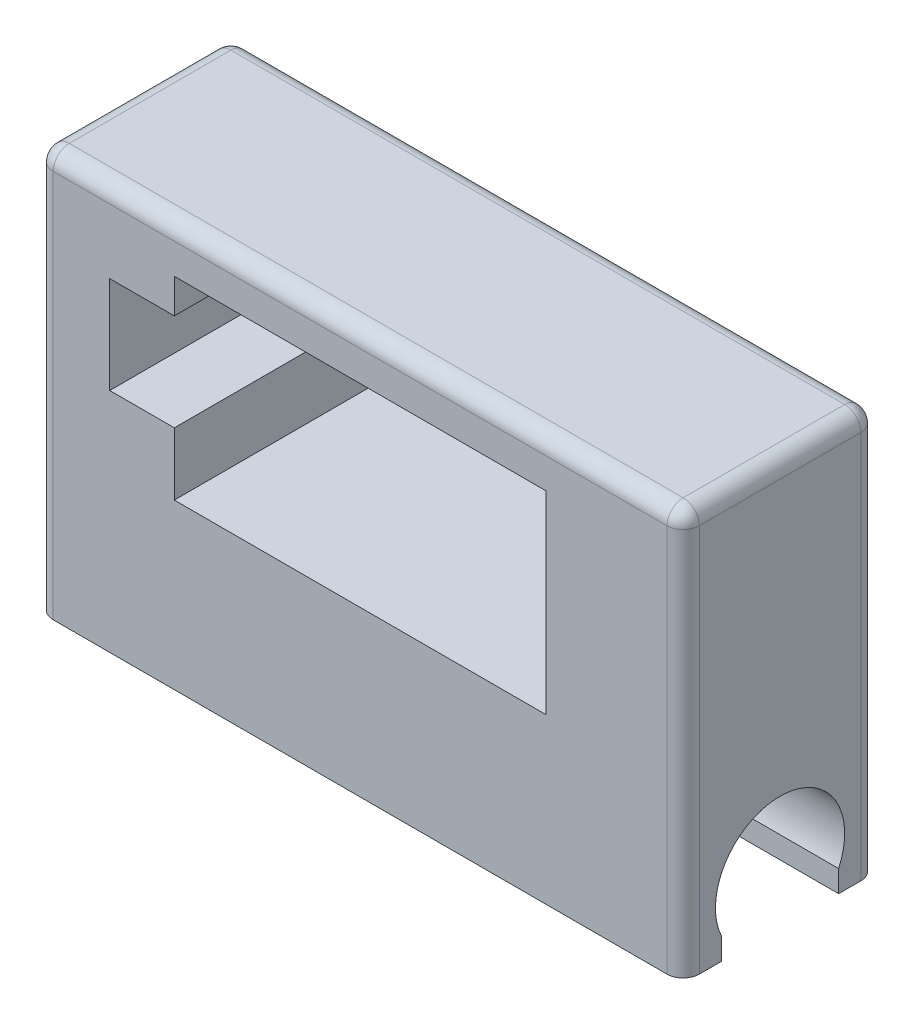
ISO-10303-21;
HEADER;
FILE_DESCRIPTION(('STEP AP214'),'2;1');
FILE_NAME('part.step','',(''),(''),'','','');
FILE_SCHEMA(('AUTOMOTIVE_DESIGN { 1 0 10303 214 1 1 1 1 }'));
ENDSEC;
DATA;
#1=APPLICATION_CONTEXT('core data for automotive mechanical design processes');
#2=APPLICATION_PROTOCOL_DEFINITION('international standard','automotive_design',2000,#1);
#3=PRODUCT_CONTEXT('',#1,'mechanical');
#4=PRODUCT('Part','Part','',(#3));
#5=PRODUCT_RELATED_PRODUCT_CATEGORY('part','',(#4));
#6=PRODUCT_DEFINITION_FORMATION('','',#4);
#7=PRODUCT_DEFINITION_CONTEXT('part definition',#1,'design');
#8=PRODUCT_DEFINITION('design','',#6,#7);
#9=PRODUCT_DEFINITION_SHAPE('','',#8);
#10=(LENGTH_UNIT() NAMED_UNIT(*) SI_UNIT(.MILLI.,.METRE.));
#11=(NAMED_UNIT(*) PLANE_ANGLE_UNIT() SI_UNIT($,.RADIAN.));
#12=(NAMED_UNIT(*) SI_UNIT($,.STERADIAN.) SOLID_ANGLE_UNIT());
#13=UNCERTAINTY_MEASURE_WITH_UNIT(LENGTH_MEASURE(1.E-05),#10,'distance_accuracy_value','');
#14=(GEOMETRIC_REPRESENTATION_CONTEXT(3) GLOBAL_UNCERTAINTY_ASSIGNED_CONTEXT((#13)) GLOBAL_UNIT_ASSIGNED_CONTEXT((#10,
#11,#12)) REPRESENTATION_CONTEXT('',''));
#15=CARTESIAN_POINT('',(0.,0.,0.));
#16=DIRECTION('',(0.,0.,1.));
#17=DIRECTION('',(1.,0.,0.));
#18=AXIS2_PLACEMENT_3D('',#15,#16,#17);
#19=CARTESIAN_POINT('',(40.,-3.04188906600156,3.625));
#20=DIRECTION('',(0.,1.,0.));
#21=DIRECTION('',(0.,0.,1.));
#22=AXIS2_PLACEMENT_3D('',#19,#20,#21);
#23=PLANE('',#22);
#24=DIRECTION('',(0.,0.,-1.));
#25=VECTOR('',#24,1.);
#26=CARTESIAN_POINT('',(40.,-3.04188906600156,3.625));
#27=LINE('',#26,#25);
#28=CARTESIAN_POINT('',(40.,-3.04188906600156,5.));
#29=VERTEX_POINT('',#28);
#30=CARTESIAN_POINT('',(40.,-3.04188906600156,3.625));
#31=VERTEX_POINT('',#30);
#32=EDGE_CURVE('E270',#29,#31,#27,.T.);
#33=ORIENTED_EDGE('',*,*,#32,.F.);
#34=CARTESIAN_POINT('',(39.,-3.04188906600156,5.));
#35=DIRECTION('',(0.,1.,0.));
#36=DIRECTION('',(0.,0.,1.));
#37=AXIS2_PLACEMENT_3D('',#34,#35,#36);
#38=CIRCLE('',#37,1.);
#39=CARTESIAN_POINT('',(39.,-3.04188906600156,6.));
#40=VERTEX_POINT('',#39);
#41=EDGE_CURVE('E376',#29,#40,#38,.F.);
#42=ORIENTED_EDGE('',*,*,#41,.T.);
#43=DIRECTION('',(-1.,0.,0.));
#44=VECTOR('',#43,1.);
#45=CARTESIAN_POINT('',(40.,-3.04188906600156,6.));
#46=LINE('',#45,#44);
#47=CARTESIAN_POINT('',(1.,-3.04188906600156,6.));
#48=VERTEX_POINT('',#47);
#49=EDGE_CURVE('E287',#40,#48,#46,.T.);
#50=ORIENTED_EDGE('',*,*,#49,.T.);
#51=CARTESIAN_POINT('',(1.,-3.04188906600156,5.));
#52=DIRECTION('',(0.,1.,0.));
#53=DIRECTION('',(0.,0.,1.));
#54=AXIS2_PLACEMENT_3D('',#51,#52,#53);
#55=CIRCLE('',#54,1.);
#56=CARTESIAN_POINT('',(0.,-3.04188906600156,5.));
#57=VERTEX_POINT('',#56);
#58=EDGE_CURVE('E373',#48,#57,#55,.F.);
#59=ORIENTED_EDGE('',*,*,#58,.T.);
#60=DIRECTION('',(0.,0.,-1.));
#61=VECTOR('',#60,1.);
#62=CARTESIAN_POINT('',(0.,-3.04188906600156,3.625));
#63=LINE('',#62,#61);
#64=CARTESIAN_POINT('',(0.,-3.04188906600156,3.625));
#65=VERTEX_POINT('',#64);
#66=EDGE_CURVE('E288',#57,#65,#63,.T.);
#67=ORIENTED_EDGE('',*,*,#66,.T.);
#68=DIRECTION('',(-1.,0.,0.));
#69=VECTOR('',#68,1.);
#70=CARTESIAN_POINT('',(40.,-3.04188906600156,3.625));
#71=LINE('',#70,#69);
#72=EDGE_CURVE('E321',#31,#65,#71,.T.);
#73=ORIENTED_EDGE('',*,*,#72,.F.);
#74=EDGE_LOOP('',(#33,#42,#50,#59,#67,#73));
#75=FACE_BOUND('',#74,.T.);
#76=ADVANCED_FACE('F45',(#75),#23,.F.);
#77=CARTESIAN_POINT('',(40.,-1.69096865730859,3.625));
#78=DIRECTION('',(0.,0.,1.));
#79=DIRECTION('',(1.,0.,0.));
#80=AXIS2_PLACEMENT_3D('',#77,#78,#79);
#81=PLANE('',#80);
#82=DIRECTION('',(0.,1.,0.));
#83=VECTOR('',#82,1.);
#84=CARTESIAN_POINT('',(0.,-1.69096865730859,3.625));
#85=LINE('',#84,#83);
#86=CARTESIAN_POINT('',(0.,-1.69096865730859,3.625));
#87=VERTEX_POINT('',#86);
#88=EDGE_CURVE('E291',#65,#87,#85,.T.);
#89=ORIENTED_EDGE('',*,*,#88,.T.);
#90=DIRECTION('',(-1.,0.,0.));
#91=VECTOR('',#90,1.);
#92=CARTESIAN_POINT('',(40.,-1.69096865730859,3.625));
#93=LINE('',#92,#91);
#94=CARTESIAN_POINT('',(40.,-1.69096865730859,3.625));
#95=VERTEX_POINT('',#94);
#96=EDGE_CURVE('E317',#95,#87,#93,.T.);
#97=ORIENTED_EDGE('',*,*,#96,.F.);
#98=DIRECTION('',(0.,1.,0.));
#99=VECTOR('',#98,1.);
#100=CARTESIAN_POINT('',(40.,-1.69096865730859,3.625));
#101=LINE('',#100,#99);
#102=EDGE_CURVE('E273',#31,#95,#101,.T.);
#103=ORIENTED_EDGE('',*,*,#102,.F.);
#104=ORIENTED_EDGE('',*,*,#72,.T.);
#105=EDGE_LOOP('',(#89,#97,#103,#104));
#106=FACE_BOUND('',#105,.T.);
#107=ADVANCED_FACE('F476',(#106),#81,.F.);
#108=CARTESIAN_POINT('',(40.,0.,0.));
#109=DIRECTION('',(-1.,0.,0.));
#110=DIRECTION('',(0.,0.,1.));
#111=AXIS2_PLACEMENT_3D('',#108,#109,#110);
#112=CYLINDRICAL_SURFACE('',#111,4.);
#113=CARTESIAN_POINT('',(0.,0.,0.));
#114=DIRECTION('',(-1.,0.,0.));
#115=DIRECTION('',(0.,0.,-1.));
#116=AXIS2_PLACEMENT_3D('',#113,#114,#115);
#117=CIRCLE('',#116,4.);
#118=CARTESIAN_POINT('',(0.,-1.69096865730859,-3.625));
#119=VERTEX_POINT('',#118);
#120=EDGE_CURVE('E294',#87,#119,#117,.T.);
#121=ORIENTED_EDGE('',*,*,#120,.T.);
#122=DIRECTION('',(-1.,0.,0.));
#123=VECTOR('',#122,1.);
#124=CARTESIAN_POINT('',(40.,-1.69096865730859,-3.625));
#125=LINE('',#124,#123);
#126=CARTESIAN_POINT('',(40.,-1.69096865730859,-3.625));
#127=VERTEX_POINT('',#126);
#128=EDGE_CURVE('E313',#127,#119,#125,.T.);
#129=ORIENTED_EDGE('',*,*,#128,.F.);
#130=CARTESIAN_POINT('',(40.,0.,0.));
#131=DIRECTION('',(-1.,0.,0.));
#132=DIRECTION('',(0.,0.,-1.));
#133=AXIS2_PLACEMENT_3D('',#130,#131,#132);
#134=CIRCLE('',#133,4.);
#135=EDGE_CURVE('E277',#95,#127,#134,.T.);
#136=ORIENTED_EDGE('',*,*,#135,.F.);
#137=ORIENTED_EDGE('',*,*,#96,.T.);
#138=EDGE_LOOP('',(#121,#129,#136,#137));
#139=FACE_BOUND('',#138,.T.);
#140=ADVANCED_FACE('F483',(#139),#112,.F.);
#141=CARTESIAN_POINT('',(40.,-1.69096865730859,-3.625));
#142=DIRECTION('',(0.,0.,-1.));
#143=DIRECTION('',(-1.,0.,0.));
#144=AXIS2_PLACEMENT_3D('',#141,#142,#143);
#145=PLANE('',#144);
#146=DIRECTION('',(0.,-1.,0.));
#147=VECTOR('',#146,1.);
#148=CARTESIAN_POINT('',(0.,-1.69096865730859,-3.625));
#149=LINE('',#148,#147);
#150=CARTESIAN_POINT('',(0.,-3.04188906600156,-3.625));
#151=VERTEX_POINT('',#150);
#152=EDGE_CURVE('E297',#119,#151,#149,.T.);
#153=ORIENTED_EDGE('',*,*,#152,.T.);
#154=DIRECTION('',(-1.,0.,0.));
#155=VECTOR('',#154,1.);
#156=CARTESIAN_POINT('',(40.,-3.04188906600156,-3.625));
#157=LINE('',#156,#155);
#158=CARTESIAN_POINT('',(40.,-3.04188906600156,-3.625));
#159=VERTEX_POINT('',#158);
#160=EDGE_CURVE('E309',#159,#151,#157,.T.);
#161=ORIENTED_EDGE('',*,*,#160,.F.);
#162=DIRECTION('',(0.,-1.,0.));
#163=VECTOR('',#162,1.);
#164=CARTESIAN_POINT('',(40.,-1.69096865730859,-3.625));
#165=LINE('',#164,#163);
#166=EDGE_CURVE('E280',#127,#159,#165,.T.);
#167=ORIENTED_EDGE('',*,*,#166,.F.);
#168=ORIENTED_EDGE('',*,*,#128,.T.);
#169=EDGE_LOOP('',(#153,#161,#167,#168));
#170=FACE_BOUND('',#169,.T.);
#171=ADVANCED_FACE('F578',(#170),#145,.F.);
#172=CARTESIAN_POINT('',(40.,-3.04188906600156,-3.625));
#173=DIRECTION('',(0.,1.,0.));
#174=DIRECTION('',(0.,0.,1.));
#175=AXIS2_PLACEMENT_3D('',#172,#173,#174);
#176=PLANE('',#175);
#177=DIRECTION('',(-1.,0.,0.));
#178=VECTOR('',#177,1.);
#179=CARTESIAN_POINT('',(40.,-3.04188906600156,-6.));
#180=LINE('',#179,#178);
#181=CARTESIAN_POINT('',(39.,-3.04188906600156,-6.));
#182=VERTEX_POINT('',#181);
#183=CARTESIAN_POINT('',(1.,-3.04188906600156,-6.));
#184=VERTEX_POINT('',#183);
#185=EDGE_CURVE('E306',#182,#184,#180,.T.);
#186=ORIENTED_EDGE('',*,*,#185,.F.);
#187=CARTESIAN_POINT('',(39.,-3.04188906600156,-5.));
#188=DIRECTION('',(0.,1.,0.));
#189=DIRECTION('',(0.,0.,1.));
#190=AXIS2_PLACEMENT_3D('',#187,#188,#189);
#191=CIRCLE('',#190,1.);
#192=CARTESIAN_POINT('',(40.,-3.04188906600156,-5.));
#193=VERTEX_POINT('',#192);
#194=EDGE_CURVE('E11',#182,#193,#191,.F.);
#195=ORIENTED_EDGE('',*,*,#194,.T.);
#196=DIRECTION('',(0.,0.,-1.));
#197=VECTOR('',#196,1.);
#198=CARTESIAN_POINT('',(40.,-3.04188906600156,-3.625));
#199=LINE('',#198,#197);
#200=EDGE_CURVE('E283',#159,#193,#199,.T.);
#201=ORIENTED_EDGE('',*,*,#200,.F.);
#202=ORIENTED_EDGE('',*,*,#160,.T.);
#203=DIRECTION('',(0.,0.,-1.));
#204=VECTOR('',#203,1.);
#205=CARTESIAN_POINT('',(0.,-3.04188906600156,-3.625));
#206=LINE('',#205,#204);
#207=CARTESIAN_POINT('',(0.,-3.04188906600156,-5.));
#208=VERTEX_POINT('',#207);
#209=EDGE_CURVE('E274',#151,#208,#206,.T.);
#210=ORIENTED_EDGE('',*,*,#209,.T.);
#211=CARTESIAN_POINT('',(1.,-3.04188906600156,-5.));
#212=DIRECTION('',(0.,1.,0.));
#213=DIRECTION('',(0.,0.,1.));
#214=AXIS2_PLACEMENT_3D('',#211,#212,#213);
#215=CIRCLE('',#214,1.);
#216=EDGE_CURVE('E55',#208,#184,#215,.F.);
#217=ORIENTED_EDGE('',*,*,#216,.T.);
#218=EDGE_LOOP('',(#186,#195,#201,#202,#210,#217));
#219=FACE_BOUND('',#218,.T.);
#220=ADVANCED_FACE('F564',(#219),#176,.F.);
#221=CARTESIAN_POINT('',(40.,-3.04188906600156,-6.));
#222=DIRECTION('',(0.,0.,1.));
#223=DIRECTION('',(0.,-1.,0.));
#224=AXIS2_PLACEMENT_3D('',#221,#222,#223);
#225=PLANE('',#224);
#226=DIRECTION('',(1.,0.,0.));
#227=VECTOR('',#226,1.);
#228=CARTESIAN_POINT('',(40.,21.,-6.));
#229=LINE('',#228,#227);
#230=CARTESIAN_POINT('',(1.,21.,-6.));
#231=VERTEX_POINT('',#230);
#232=CARTESIAN_POINT('',(39.,21.,-6.));
#233=VERTEX_POINT('',#232);
#234=EDGE_CURVE('E63',#231,#233,#229,.T.);
#235=ORIENTED_EDGE('',*,*,#234,.T.);
#236=DIRECTION('',(0.,1.,0.));
#237=VECTOR('',#236,1.);
#238=CARTESIAN_POINT('',(39.,-3.04188906600156,-6.));
#239=LINE('',#238,#237);
#240=EDGE_CURVE('E370',#233,#182,#239,.F.);
#241=ORIENTED_EDGE('',*,*,#240,.T.);
#242=ORIENTED_EDGE('',*,*,#185,.T.);
#243=DIRECTION('',(0.,1.,0.));
#244=VECTOR('',#243,1.);
#245=CARTESIAN_POINT('',(1.,-3.04188906600156,-6.));
#246=LINE('',#245,#244);
#247=EDGE_CURVE('E68',#184,#231,#246,.T.);
#248=ORIENTED_EDGE('',*,*,#247,.T.);
#249=EDGE_LOOP('',(#235,#241,#242,#248));
#250=FACE_BOUND('',#249,.T.);
#251=DIRECTION('',(-1.,0.,0.));
#252=VECTOR('',#251,1.);
#253=CARTESIAN_POINT('',(8.5,7.125,-6.));
#254=LINE('',#253,#252);
#255=CARTESIAN_POINT('',(31.5,7.125,-6.));
#256=VERTEX_POINT('',#255);
#257=CARTESIAN_POINT('',(8.5,7.125,-6.));
#258=VERTEX_POINT('',#257);
#259=EDGE_CURVE('E250',#256,#258,#254,.T.);
#260=ORIENTED_EDGE('',*,*,#259,.F.);
#261=DIRECTION('',(0.,-1.,0.));
#262=VECTOR('',#261,1.);
#263=CARTESIAN_POINT('',(31.5,7.12500000000001,-6.));
#264=LINE('',#263,#262);
#265=CARTESIAN_POINT('',(31.5,19.125,-6.));
#266=VERTEX_POINT('',#265);
#267=EDGE_CURVE('E204',#266,#256,#264,.T.);
#268=ORIENTED_EDGE('',*,*,#267,.F.);
#269=DIRECTION('',(1.,0.,0.));
#270=VECTOR('',#269,1.);
#271=CARTESIAN_POINT('',(8.5,19.125,-6.));
#272=LINE('',#271,#270);
#273=CARTESIAN_POINT('',(8.5,19.125,-6.));
#274=VERTEX_POINT('',#273);
#275=EDGE_CURVE('E448',#274,#266,#272,.T.);
#276=ORIENTED_EDGE('',*,*,#275,.F.);
#277=DIRECTION('',(0.,1.,0.));
#278=VECTOR('',#277,1.);
#279=CARTESIAN_POINT('',(8.5,17.,-6.));
#280=LINE('',#279,#278);
#281=CARTESIAN_POINT('',(8.5,17.,-6.));
#282=VERTEX_POINT('',#281);
#283=EDGE_CURVE('E444',#282,#274,#280,.T.);
#284=ORIENTED_EDGE('',*,*,#283,.F.);
#285=DIRECTION('',(1.,0.,0.));
#286=VECTOR('',#285,1.);
#287=CARTESIAN_POINT('',(8.5,17.,-6.));
#288=LINE('',#287,#286);
#289=CARTESIAN_POINT('',(4.5,17.,-6.));
#290=VERTEX_POINT('',#289);
#291=EDGE_CURVE('E440',#290,#282,#288,.T.);
#292=ORIENTED_EDGE('',*,*,#291,.F.);
#293=DIRECTION('',(0.,1.,0.));
#294=VECTOR('',#293,1.);
#295=CARTESIAN_POINT('',(4.5,11.,-6.));
#296=LINE('',#295,#294);
#297=CARTESIAN_POINT('',(4.5,11.,-6.));
#298=VERTEX_POINT('',#297);
#299=EDGE_CURVE('E436',#298,#290,#296,.T.);
#300=ORIENTED_EDGE('',*,*,#299,.F.);
#301=DIRECTION('',(-1.,0.,0.));
#302=VECTOR('',#301,1.);
#303=CARTESIAN_POINT('',(8.5,11.,-6.));
#304=LINE('',#303,#302);
#305=CARTESIAN_POINT('',(8.5,11.,-6.));
#306=VERTEX_POINT('',#305);
#307=EDGE_CURVE('E432',#306,#298,#304,.T.);
#308=ORIENTED_EDGE('',*,*,#307,.F.);
#309=DIRECTION('',(0.,1.,0.));
#310=VECTOR('',#309,1.);
#311=CARTESIAN_POINT('',(8.5,7.12500000000001,-6.));
#312=LINE('',#311,#310);
#313=EDGE_CURVE('E269',#258,#306,#312,.T.);
#314=ORIENTED_EDGE('',*,*,#313,.F.);
#315=EDGE_LOOP('',(#260,#268,#276,#284,#292,#300,#308,#314));
#316=FACE_BOUND('',#315,.T.);
#317=ADVANCED_FACE('F457',(#250,#316),#225,.F.);
#318=CARTESIAN_POINT('',(40.,-3.04188906600156,6.));
#319=DIRECTION('',(0.,0.,-1.));
#320=DIRECTION('',(0.,1.,0.));
#321=AXIS2_PLACEMENT_3D('',#318,#319,#320);
#322=PLANE('',#321);
#323=ORIENTED_EDGE('',*,*,#49,.F.);
#324=DIRECTION('',(0.,-1.,0.));
#325=VECTOR('',#324,1.);
#326=CARTESIAN_POINT('',(39.,22.,6.));
#327=LINE('',#326,#325);
#328=CARTESIAN_POINT('',(39.,21.,6.));
#329=VERTEX_POINT('',#328);
#330=EDGE_CURVE('E354',#40,#329,#327,.F.);
#331=ORIENTED_EDGE('',*,*,#330,.T.);
#332=DIRECTION('',(-1.,0.,0.));
#333=VECTOR('',#332,1.);
#334=CARTESIAN_POINT('',(0.,21.,6.));
#335=LINE('',#334,#333);
#336=CARTESIAN_POINT('',(1.,21.,6.));
#337=VERTEX_POINT('',#336);
#338=EDGE_CURVE('E351',#329,#337,#335,.T.);
#339=ORIENTED_EDGE('',*,*,#338,.T.);
#340=DIRECTION('',(0.,-1.,0.));
#341=VECTOR('',#340,1.);
#342=CARTESIAN_POINT('',(1.,-3.04188906600156,6.));
#343=LINE('',#342,#341);
#344=EDGE_CURVE('E348',#337,#48,#343,.T.);
#345=ORIENTED_EDGE('',*,*,#344,.T.);
#346=EDGE_LOOP('',(#323,#331,#339,#345));
#347=FACE_BOUND('',#346,.T.);
#348=DIRECTION('',(1.,0.,0.));
#349=VECTOR('',#348,1.);
#350=CARTESIAN_POINT('',(8.5,7.125,6.));
#351=LINE('',#350,#349);
#352=CARTESIAN_POINT('',(8.5,7.125,6.));
#353=VERTEX_POINT('',#352);
#354=CARTESIAN_POINT('',(31.5,7.125,6.));
#355=VERTEX_POINT('',#354);
#356=EDGE_CURVE('E212',#353,#355,#351,.T.);
#357=ORIENTED_EDGE('',*,*,#356,.F.);
#358=DIRECTION('',(0.,-1.,0.));
#359=VECTOR('',#358,1.);
#360=CARTESIAN_POINT('',(8.5,7.125,6.));
#361=LINE('',#360,#359);
#362=CARTESIAN_POINT('',(8.5,11.,6.));
#363=VERTEX_POINT('',#362);
#364=EDGE_CURVE('E219',#363,#353,#361,.T.);
#365=ORIENTED_EDGE('',*,*,#364,.F.);
#366=DIRECTION('',(1.,0.,0.));
#367=VECTOR('',#366,1.);
#368=CARTESIAN_POINT('',(8.5,11.,6.));
#369=LINE('',#368,#367);
#370=CARTESIAN_POINT('',(4.5,11.,6.));
#371=VERTEX_POINT('',#370);
#372=EDGE_CURVE('E243',#371,#363,#369,.T.);
#373=ORIENTED_EDGE('',*,*,#372,.F.);
#374=DIRECTION('',(0.,-1.,0.));
#375=VECTOR('',#374,1.);
#376=CARTESIAN_POINT('',(4.5,11.,6.));
#377=LINE('',#376,#375);
#378=CARTESIAN_POINT('',(4.5,17.,6.));
#379=VERTEX_POINT('',#378);
#380=EDGE_CURVE('E239',#379,#371,#377,.T.);
#381=ORIENTED_EDGE('',*,*,#380,.F.);
#382=DIRECTION('',(-1.,0.,0.));
#383=VECTOR('',#382,1.);
#384=CARTESIAN_POINT('',(8.5,17.,6.));
#385=LINE('',#384,#383);
#386=CARTESIAN_POINT('',(8.5,17.,6.));
#387=VERTEX_POINT('',#386);
#388=EDGE_CURVE('E235',#387,#379,#385,.T.);
#389=ORIENTED_EDGE('',*,*,#388,.F.);
#390=DIRECTION('',(0.,-1.,0.));
#391=VECTOR('',#390,1.);
#392=CARTESIAN_POINT('',(8.5,17.,6.));
#393=LINE('',#392,#391);
#394=CARTESIAN_POINT('',(8.5,19.125,6.));
#395=VERTEX_POINT('',#394);
#396=EDGE_CURVE('E228',#395,#387,#393,.T.);
#397=ORIENTED_EDGE('',*,*,#396,.F.);
#398=DIRECTION('',(-1.,0.,0.));
#399=VECTOR('',#398,1.);
#400=CARTESIAN_POINT('',(8.5,19.125,6.));
#401=LINE('',#400,#399);
#402=CARTESIAN_POINT('',(31.5,19.125,6.));
#403=VERTEX_POINT('',#402);
#404=EDGE_CURVE('E224',#403,#395,#401,.T.);
#405=ORIENTED_EDGE('',*,*,#404,.F.);
#406=DIRECTION('',(0.,1.,0.));
#407=VECTOR('',#406,1.);
#408=CARTESIAN_POINT('',(31.5,7.125,6.));
#409=LINE('',#408,#407);
#410=EDGE_CURVE('E202',#355,#403,#409,.T.);
#411=ORIENTED_EDGE('',*,*,#410,.F.);
#412=EDGE_LOOP('',(#357,#365,#373,#381,#389,#397,#405,#411));
#413=FACE_BOUND('',#412,.T.);
#414=ADVANCED_FACE('F221',(#347,#413),#322,.F.);
#415=CARTESIAN_POINT('',(40.,0.,0.));
#416=DIRECTION('',(1.,0.,0.));
#417=DIRECTION('',(0.,0.,-1.));
#418=AXIS2_PLACEMENT_3D('',#415,#416,#417);
#419=PLANE('',#418);
#420=DIRECTION('',(0.,0.,1.));
#421=VECTOR('',#420,1.);
#422=CARTESIAN_POINT('',(40.,21.,0.));
#423=LINE('',#422,#421);
#424=CARTESIAN_POINT('',(40.,21.,-5.));
#425=VERTEX_POINT('',#424);
#426=CARTESIAN_POINT('',(40.,21.,5.));
#427=VERTEX_POINT('',#426);
#428=EDGE_CURVE('E328',#425,#427,#423,.T.);
#429=ORIENTED_EDGE('',*,*,#428,.T.);
#430=DIRECTION('',(0.,-1.,0.));
#431=VECTOR('',#430,1.);
#432=CARTESIAN_POINT('',(40.,-3.04188906600156,5.));
#433=LINE('',#432,#431);
#434=EDGE_CURVE('E332',#427,#29,#433,.T.);
#435=ORIENTED_EDGE('',*,*,#434,.T.);
#436=ORIENTED_EDGE('',*,*,#32,.T.);
#437=ORIENTED_EDGE('',*,*,#102,.T.);
#438=ORIENTED_EDGE('',*,*,#135,.T.);
#439=ORIENTED_EDGE('',*,*,#166,.T.);
#440=ORIENTED_EDGE('',*,*,#200,.T.);
#441=DIRECTION('',(0.,1.,0.));
#442=VECTOR('',#441,1.);
#443=CARTESIAN_POINT('',(40.,22.,-5.));
#444=LINE('',#443,#442);
#445=EDGE_CURVE('E325',#193,#425,#444,.T.);
#446=ORIENTED_EDGE('',*,*,#445,.T.);
#447=EDGE_LOOP('',(#429,#435,#436,#437,#438,#439,#440,#446));
#448=FACE_BOUND('',#447,.T.);
#449=ADVANCED_FACE('F573',(#448),#419,.T.);
#450=CARTESIAN_POINT('',(0.,0.,0.));
#451=DIRECTION('',(1.,0.,0.));
#452=DIRECTION('',(0.,0.,-1.));
#453=AXIS2_PLACEMENT_3D('',#450,#451,#452);
#454=PLANE('',#453);
#455=ORIENTED_EDGE('',*,*,#66,.F.);
#456=DIRECTION('',(0.,-1.,0.));
#457=VECTOR('',#456,1.);
#458=CARTESIAN_POINT('',(0.,0.,5.));
#459=LINE('',#458,#457);
#460=CARTESIAN_POINT('',(0.,21.,5.));
#461=VERTEX_POINT('',#460);
#462=EDGE_CURVE('E363',#57,#461,#459,.F.);
#463=ORIENTED_EDGE('',*,*,#462,.T.);
#464=DIRECTION('',(0.,0.,1.));
#465=VECTOR('',#464,1.);
#466=CARTESIAN_POINT('',(0.,21.,-6.));
#467=LINE('',#466,#465);
#468=CARTESIAN_POINT('',(0.,21.,-5.));
#469=VERTEX_POINT('',#468);
#470=EDGE_CURVE('E360',#461,#469,#467,.F.);
#471=ORIENTED_EDGE('',*,*,#470,.T.);
#472=DIRECTION('',(0.,1.,0.));
#473=VECTOR('',#472,1.);
#474=CARTESIAN_POINT('',(0.,0.,-5.));
#475=LINE('',#474,#473);
#476=EDGE_CURVE('E357',#469,#208,#475,.F.);
#477=ORIENTED_EDGE('',*,*,#476,.T.);
#478=ORIENTED_EDGE('',*,*,#209,.F.);
#479=ORIENTED_EDGE('',*,*,#152,.F.);
#480=ORIENTED_EDGE('',*,*,#120,.F.);
#481=ORIENTED_EDGE('',*,*,#88,.F.);
#482=EDGE_LOOP('',(#455,#463,#471,#477,#478,#479,#480,#481));
#483=FACE_BOUND('',#482,.T.);
#484=ADVANCED_FACE('F540',(#483),#454,.F.);
#485=CARTESIAN_POINT('',(0.,22.,-49.081318457076));
#486=DIRECTION('',(0.,1.,0.));
#487=DIRECTION('',(0.,0.,1.));
#488=AXIS2_PLACEMENT_3D('',#485,#486,#487);
#489=PLANE('',#488);
#490=DIRECTION('',(-1.,0.,0.));
#491=VECTOR('',#490,1.);
#492=CARTESIAN_POINT('',(40.,22.,5.));
#493=LINE('',#492,#491);
#494=CARTESIAN_POINT('',(1.,22.,5.));
#495=VERTEX_POINT('',#494);
#496=CARTESIAN_POINT('',(39.,22.,5.));
#497=VERTEX_POINT('',#496);
#498=EDGE_CURVE('E341',#495,#497,#493,.F.);
#499=ORIENTED_EDGE('',*,*,#498,.T.);
#500=DIRECTION('',(0.,0.,1.));
#501=VECTOR('',#500,1.);
#502=CARTESIAN_POINT('',(39.,22.,-49.081318457076));
#503=LINE('',#502,#501);
#504=CARTESIAN_POINT('',(39.,22.,-5.));
#505=VERTEX_POINT('',#504);
#506=EDGE_CURVE('E344',#497,#505,#503,.F.);
#507=ORIENTED_EDGE('',*,*,#506,.T.);
#508=DIRECTION('',(1.,0.,0.));
#509=VECTOR('',#508,1.);
#510=CARTESIAN_POINT('',(0.,22.,-5.));
#511=LINE('',#510,#509);
#512=CARTESIAN_POINT('',(1.,22.,-5.));
#513=VERTEX_POINT('',#512);
#514=EDGE_CURVE('E335',#505,#513,#511,.F.);
#515=ORIENTED_EDGE('',*,*,#514,.T.);
#516=DIRECTION('',(0.,0.,1.));
#517=VECTOR('',#516,1.);
#518=CARTESIAN_POINT('',(1.,22.,6.));
#519=LINE('',#518,#517);
#520=EDGE_CURVE('E338',#513,#495,#519,.T.);
#521=ORIENTED_EDGE('',*,*,#520,.T.);
#522=EDGE_LOOP('',(#499,#507,#515,#521));
#523=FACE_BOUND('',#522,.T.);
#524=ADVANCED_FACE('F595',(#523),#489,.T.);
#525=CARTESIAN_POINT('',(8.5,7.125,-49.081318457076));
#526=DIRECTION('',(0.,-1.,0.));
#527=DIRECTION('',(1.,0.,0.));
#528=AXIS2_PLACEMENT_3D('',#525,#526,#527);
#529=PLANE('',#528);
#530=DIRECTION('',(0.,0.,1.));
#531=VECTOR('',#530,1.);
#532=CARTESIAN_POINT('',(31.5,7.125,-49.081318457076));
#533=LINE('',#532,#531);
#534=EDGE_CURVE('E197',#256,#355,#533,.T.);
#535=ORIENTED_EDGE('',*,*,#534,.F.);
#536=ORIENTED_EDGE('',*,*,#259,.T.);
#537=DIRECTION('',(0.,0.,1.));
#538=VECTOR('',#537,1.);
#539=CARTESIAN_POINT('',(8.5,7.125,-49.081318457076));
#540=LINE('',#539,#538);
#541=EDGE_CURVE('E209',#258,#353,#540,.T.);
#542=ORIENTED_EDGE('',*,*,#541,.T.);
#543=ORIENTED_EDGE('',*,*,#356,.T.);
#544=EDGE_LOOP('',(#535,#536,#542,#543));
#545=FACE_BOUND('',#544,.T.);
#546=ADVANCED_FACE('F213',(#545),#529,.F.);
#547=CARTESIAN_POINT('',(31.5,7.125,-49.081318457076));
#548=DIRECTION('',(1.,0.,0.));
#549=DIRECTION('',(0.,0.,-1.));
#550=AXIS2_PLACEMENT_3D('',#547,#548,#549);
#551=PLANE('',#550);
#552=DIRECTION('',(0.,0.,1.));
#553=VECTOR('',#552,1.);
#554=CARTESIAN_POINT('',(31.5,19.125,-49.081318457076));
#555=LINE('',#554,#553);
#556=EDGE_CURVE('E208',#266,#403,#555,.T.);
#557=ORIENTED_EDGE('',*,*,#556,.F.);
#558=ORIENTED_EDGE('',*,*,#267,.T.);
#559=ORIENTED_EDGE('',*,*,#534,.T.);
#560=ORIENTED_EDGE('',*,*,#410,.T.);
#561=EDGE_LOOP('',(#557,#558,#559,#560));
#562=FACE_BOUND('',#561,.T.);
#563=ADVANCED_FACE('F200',(#562),#551,.F.);
#564=CARTESIAN_POINT('',(8.5,19.125,-49.081318457076));
#565=DIRECTION('',(0.,1.,0.));
#566=DIRECTION('',(-1.,0.,0.));
#567=AXIS2_PLACEMENT_3D('',#564,#565,#566);
#568=PLANE('',#567);
#569=DIRECTION('',(0.,0.,1.));
#570=VECTOR('',#569,1.);
#571=CARTESIAN_POINT('',(8.5,19.125,-49.081318457076));
#572=LINE('',#571,#570);
#573=EDGE_CURVE('E260',#274,#395,#572,.T.);
#574=ORIENTED_EDGE('',*,*,#573,.F.);
#575=ORIENTED_EDGE('',*,*,#275,.T.);
#576=ORIENTED_EDGE('',*,*,#556,.T.);
#577=ORIENTED_EDGE('',*,*,#404,.T.);
#578=EDGE_LOOP('',(#574,#575,#576,#577));
#579=FACE_BOUND('',#578,.T.);
#580=ADVANCED_FACE('F455',(#579),#568,.F.);
#581=CARTESIAN_POINT('',(8.5,17.,-49.081318457076));
#582=DIRECTION('',(-1.,0.,0.));
#583=DIRECTION('',(0.,0.,1.));
#584=AXIS2_PLACEMENT_3D('',#581,#582,#583);
#585=PLANE('',#584);
#586=DIRECTION('',(0.,0.,1.));
#587=VECTOR('',#586,1.);
#588=CARTESIAN_POINT('',(8.5,17.,-49.081318457076));
#589=LINE('',#588,#587);
#590=EDGE_CURVE('E257',#282,#387,#589,.T.);
#591=ORIENTED_EDGE('',*,*,#590,.F.);
#592=ORIENTED_EDGE('',*,*,#283,.T.);
#593=ORIENTED_EDGE('',*,*,#573,.T.);
#594=ORIENTED_EDGE('',*,*,#396,.T.);
#595=EDGE_LOOP('',(#591,#592,#593,#594));
#596=FACE_BOUND('',#595,.T.);
#597=ADVANCED_FACE('F609',(#596),#585,.F.);
#598=CARTESIAN_POINT('',(8.5,17.,-49.081318457076));
#599=DIRECTION('',(0.,1.,0.));
#600=DIRECTION('',(0.,0.,1.));
#601=AXIS2_PLACEMENT_3D('',#598,#599,#600);
#602=PLANE('',#601);
#603=DIRECTION('',(0.,0.,1.));
#604=VECTOR('',#603,1.);
#605=CARTESIAN_POINT('',(4.5,17.,-49.081318457076));
#606=LINE('',#605,#604);
#607=EDGE_CURVE('E254',#290,#379,#606,.T.);
#608=ORIENTED_EDGE('',*,*,#607,.F.);
#609=ORIENTED_EDGE('',*,*,#291,.T.);
#610=ORIENTED_EDGE('',*,*,#590,.T.);
#611=ORIENTED_EDGE('',*,*,#388,.T.);
#612=EDGE_LOOP('',(#608,#609,#610,#611));
#613=FACE_BOUND('',#612,.T.);
#614=ADVANCED_FACE('F612',(#613),#602,.F.);
#615=CARTESIAN_POINT('',(4.5,11.,-49.081318457076));
#616=DIRECTION('',(-1.,0.,0.));
#617=DIRECTION('',(0.,0.,1.));
#618=AXIS2_PLACEMENT_3D('',#615,#616,#617);
#619=PLANE('',#618);
#620=DIRECTION('',(0.,0.,1.));
#621=VECTOR('',#620,1.);
#622=CARTESIAN_POINT('',(4.5,11.,-49.081318457076));
#623=LINE('',#622,#621);
#624=EDGE_CURVE('E251',#298,#371,#623,.T.);
#625=ORIENTED_EDGE('',*,*,#624,.F.);
#626=ORIENTED_EDGE('',*,*,#299,.T.);
#627=ORIENTED_EDGE('',*,*,#607,.T.);
#628=ORIENTED_EDGE('',*,*,#380,.T.);
#629=EDGE_LOOP('',(#625,#626,#627,#628));
#630=FACE_BOUND('',#629,.T.);
#631=ADVANCED_FACE('F471',(#630),#619,.F.);
#632=CARTESIAN_POINT('',(8.5,11.,-49.081318457076));
#633=DIRECTION('',(0.,-1.,0.));
#634=DIRECTION('',(0.,0.,-1.));
#635=AXIS2_PLACEMENT_3D('',#632,#633,#634);
#636=PLANE('',#635);
#637=DIRECTION('',(0.,0.,1.));
#638=VECTOR('',#637,1.);
#639=CARTESIAN_POINT('',(8.5,11.,-49.081318457076));
#640=LINE('',#639,#638);
#641=EDGE_CURVE('E247',#306,#363,#640,.T.);
#642=ORIENTED_EDGE('',*,*,#641,.F.);
#643=ORIENTED_EDGE('',*,*,#307,.T.);
#644=ORIENTED_EDGE('',*,*,#624,.T.);
#645=ORIENTED_EDGE('',*,*,#372,.T.);
#646=EDGE_LOOP('',(#642,#643,#644,#645));
#647=FACE_BOUND('',#646,.T.);
#648=ADVANCED_FACE('F462',(#647),#636,.F.);
#649=CARTESIAN_POINT('',(8.5,7.125,-49.081318457076));
#650=DIRECTION('',(-1.,0.,0.));
#651=DIRECTION('',(0.,-1.,0.));
#652=AXIS2_PLACEMENT_3D('',#649,#650,#651);
#653=PLANE('',#652);
#654=ORIENTED_EDGE('',*,*,#541,.F.);
#655=ORIENTED_EDGE('',*,*,#313,.T.);
#656=ORIENTED_EDGE('',*,*,#641,.T.);
#657=ORIENTED_EDGE('',*,*,#364,.T.);
#658=EDGE_LOOP('',(#654,#655,#656,#657));
#659=FACE_BOUND('',#658,.T.);
#660=ADVANCED_FACE('F460',(#659),#653,.F.);
#661=CARTESIAN_POINT('',(1.,-3.04188906600156,-5.));
#662=DIRECTION('',(0.,1.,0.));
#663=DIRECTION('',(0.,0.,1.));
#664=AXIS2_PLACEMENT_3D('',#661,#662,#663);
#665=CYLINDRICAL_SURFACE('',#664,1.);
#666=ORIENTED_EDGE('',*,*,#216,.F.);
#667=ORIENTED_EDGE('',*,*,#476,.F.);
#668=CARTESIAN_POINT('',(1.,21.,-5.));
#669=DIRECTION('',(0.,1.,0.));
#670=DIRECTION('',(0.,0.,1.));
#671=AXIS2_PLACEMENT_3D('',#668,#669,#670);
#672=CIRCLE('',#671,1.);
#673=EDGE_CURVE('E418',#231,#469,#672,.T.);
#674=ORIENTED_EDGE('',*,*,#673,.F.);
#675=ORIENTED_EDGE('',*,*,#247,.F.);
#676=EDGE_LOOP('',(#666,#667,#674,#675));
#677=FACE_BOUND('',#676,.T.);
#678=ADVANCED_FACE('F47',(#677),#665,.T.);
#679=CARTESIAN_POINT('',(1.,-3.04188906600156,5.));
#680=DIRECTION('',(0.,-1.,0.));
#681=DIRECTION('',(0.,0.,-1.));
#682=AXIS2_PLACEMENT_3D('',#679,#680,#681);
#683=CYLINDRICAL_SURFACE('',#682,1.);
#684=ORIENTED_EDGE('',*,*,#58,.F.);
#685=ORIENTED_EDGE('',*,*,#344,.F.);
#686=CARTESIAN_POINT('',(1.,21.,5.));
#687=DIRECTION('',(0.,1.,0.));
#688=DIRECTION('',(0.,0.,1.));
#689=AXIS2_PLACEMENT_3D('',#686,#687,#688);
#690=CIRCLE('',#689,1.);
#691=EDGE_CURVE('E415',#461,#337,#690,.T.);
#692=ORIENTED_EDGE('',*,*,#691,.F.);
#693=ORIENTED_EDGE('',*,*,#462,.F.);
#694=EDGE_LOOP('',(#684,#685,#692,#693));
#695=FACE_BOUND('',#694,.T.);
#696=ADVANCED_FACE('F469',(#695),#683,.T.);
#697=CARTESIAN_POINT('',(1.,21.,-49.081318457076));
#698=DIRECTION('',(0.,0.,-1.));
#699=DIRECTION('',(-1.,0.,0.));
#700=AXIS2_PLACEMENT_3D('',#697,#698,#699);
#701=CYLINDRICAL_SURFACE('',#700,1.);
#702=CARTESIAN_POINT('',(1.,21.,-5.));
#703=DIRECTION('',(0.,0.,-1.));
#704=DIRECTION('',(-1.,0.,0.));
#705=AXIS2_PLACEMENT_3D('',#702,#703,#704);
#706=CIRCLE('',#705,1.);
#707=EDGE_CURVE('E49',#469,#513,#706,.T.);
#708=ORIENTED_EDGE('',*,*,#707,.F.);
#709=ORIENTED_EDGE('',*,*,#470,.F.);
#710=CARTESIAN_POINT('',(1.,21.,5.));
#711=DIRECTION('',(0.,0.,1.));
#712=DIRECTION('',(1.,0.,0.));
#713=AXIS2_PLACEMENT_3D('',#710,#711,#712);
#714=CIRCLE('',#713,1.);
#715=EDGE_CURVE('E411',#495,#461,#714,.T.);
#716=ORIENTED_EDGE('',*,*,#715,.F.);
#717=ORIENTED_EDGE('',*,*,#520,.F.);
#718=EDGE_LOOP('',(#708,#709,#716,#717));
#719=FACE_BOUND('',#718,.T.);
#720=ADVANCED_FACE('F524',(#719),#701,.T.);
#721=CARTESIAN_POINT('',(1.,21.,-5.));
#722=DIRECTION('',(-1.,0.,0.));
#723=DIRECTION('',(0.,0.,1.));
#724=AXIS2_PLACEMENT_3D('',#721,#722,#723);
#725=SPHERICAL_SURFACE('',#724,1.);
#726=ORIENTED_EDGE('',*,*,#673,.T.);
#727=ORIENTED_EDGE('',*,*,#707,.T.);
#728=CARTESIAN_POINT('',(1.,21.,-5.));
#729=DIRECTION('',(-1.,0.,0.));
#730=DIRECTION('',(0.,0.,1.));
#731=AXIS2_PLACEMENT_3D('',#728,#729,#730);
#732=CIRCLE('',#731,1.);
#733=EDGE_CURVE('E407',#231,#513,#732,.F.);
#734=ORIENTED_EDGE('',*,*,#733,.F.);
#735=EDGE_LOOP('',(#726,#727,#734));
#736=FACE_BOUND('',#735,.T.);
#737=ADVANCED_FACE('F520',(#736),#725,.T.);
#738=CARTESIAN_POINT('',(1.,21.,5.));
#739=DIRECTION('',(-1.,0.,0.));
#740=DIRECTION('',(0.,0.,1.));
#741=AXIS2_PLACEMENT_3D('',#738,#739,#740);
#742=SPHERICAL_SURFACE('',#741,1.);
#743=ORIENTED_EDGE('',*,*,#715,.T.);
#744=ORIENTED_EDGE('',*,*,#691,.T.);
#745=CARTESIAN_POINT('',(1.,21.,5.));
#746=DIRECTION('',(-1.,0.,0.));
#747=DIRECTION('',(0.,-1.,0.));
#748=AXIS2_PLACEMENT_3D('',#745,#746,#747);
#749=CIRCLE('',#748,1.);
#750=EDGE_CURVE('E403',#495,#337,#749,.F.);
#751=ORIENTED_EDGE('',*,*,#750,.F.);
#752=EDGE_LOOP('',(#743,#744,#751));
#753=FACE_BOUND('',#752,.T.);
#754=ADVANCED_FACE('F516',(#753),#742,.T.);
#755=CARTESIAN_POINT('',(40.,21.,-5.));
#756=DIRECTION('',(-1.,0.,0.));
#757=DIRECTION('',(0.,0.,1.));
#758=AXIS2_PLACEMENT_3D('',#755,#756,#757);
#759=CYLINDRICAL_SURFACE('',#758,1.);
#760=ORIENTED_EDGE('',*,*,#733,.T.);
#761=ORIENTED_EDGE('',*,*,#514,.F.);
#762=CARTESIAN_POINT('',(39.,21.,-5.));
#763=DIRECTION('',(1.,0.,0.));
#764=DIRECTION('',(0.,0.,-1.));
#765=AXIS2_PLACEMENT_3D('',#762,#763,#764);
#766=CIRCLE('',#765,1.);
#767=EDGE_CURVE('E399',#233,#505,#766,.T.);
#768=ORIENTED_EDGE('',*,*,#767,.F.);
#769=ORIENTED_EDGE('',*,*,#234,.F.);
#770=EDGE_LOOP('',(#760,#761,#768,#769));
#771=FACE_BOUND('',#770,.T.);
#772=ADVANCED_FACE('F512',(#771),#759,.T.);
#773=CARTESIAN_POINT('',(39.,0.,-5.));
#774=DIRECTION('',(0.,-1.,0.));
#775=DIRECTION('',(0.,0.,-1.));
#776=AXIS2_PLACEMENT_3D('',#773,#774,#775);
#777=CYLINDRICAL_SURFACE('',#776,1.);
#778=ORIENTED_EDGE('',*,*,#194,.F.);
#779=ORIENTED_EDGE('',*,*,#240,.F.);
#780=CARTESIAN_POINT('',(39.,21.,-5.));
#781=DIRECTION('',(0.,1.,0.));
#782=DIRECTION('',(0.,0.,1.));
#783=AXIS2_PLACEMENT_3D('',#780,#781,#782);
#784=CIRCLE('',#783,1.);
#785=EDGE_CURVE('E395',#425,#233,#784,.T.);
#786=ORIENTED_EDGE('',*,*,#785,.F.);
#787=ORIENTED_EDGE('',*,*,#445,.F.);
#788=EDGE_LOOP('',(#778,#779,#786,#787));
#789=FACE_BOUND('',#788,.T.);
#790=ADVANCED_FACE('F508',(#789),#777,.T.);
#791=CARTESIAN_POINT('',(39.,0.,5.));
#792=DIRECTION('',(0.,1.,0.));
#793=DIRECTION('',(0.,0.,1.));
#794=AXIS2_PLACEMENT_3D('',#791,#792,#793);
#795=CYLINDRICAL_SURFACE('',#794,1.);
#796=ORIENTED_EDGE('',*,*,#41,.F.);
#797=ORIENTED_EDGE('',*,*,#434,.F.);
#798=CARTESIAN_POINT('',(39.,21.,5.));
#799=DIRECTION('',(0.,1.,0.));
#800=DIRECTION('',(0.,0.,1.));
#801=AXIS2_PLACEMENT_3D('',#798,#799,#800);
#802=CIRCLE('',#801,1.);
#803=EDGE_CURVE('E391',#329,#427,#802,.T.);
#804=ORIENTED_EDGE('',*,*,#803,.F.);
#805=ORIENTED_EDGE('',*,*,#330,.F.);
#806=EDGE_LOOP('',(#796,#797,#804,#805));
#807=FACE_BOUND('',#806,.T.);
#808=ADVANCED_FACE('F504',(#807),#795,.T.);
#809=CARTESIAN_POINT('',(40.,21.,5.));
#810=DIRECTION('',(1.,0.,0.));
#811=DIRECTION('',(0.,0.,-1.));
#812=AXIS2_PLACEMENT_3D('',#809,#810,#811);
#813=CYLINDRICAL_SURFACE('',#812,1.);
#814=ORIENTED_EDGE('',*,*,#750,.T.);
#815=ORIENTED_EDGE('',*,*,#338,.F.);
#816=CARTESIAN_POINT('',(39.,21.,5.));
#817=DIRECTION('',(1.,0.,0.));
#818=DIRECTION('',(0.,0.,-1.));
#819=AXIS2_PLACEMENT_3D('',#816,#817,#818);
#820=CIRCLE('',#819,1.);
#821=EDGE_CURVE('E387',#497,#329,#820,.T.);
#822=ORIENTED_EDGE('',*,*,#821,.F.);
#823=ORIENTED_EDGE('',*,*,#498,.F.);
#824=EDGE_LOOP('',(#814,#815,#822,#823));
#825=FACE_BOUND('',#824,.T.);
#826=ADVANCED_FACE('F500',(#825),#813,.T.);
#827=CARTESIAN_POINT('',(39.,21.,-5.));
#828=DIRECTION('',(0.,0.,-1.));
#829=DIRECTION('',(-1.,0.,0.));
#830=AXIS2_PLACEMENT_3D('',#827,#828,#829);
#831=SPHERICAL_SURFACE('',#830,1.);
#832=ORIENTED_EDGE('',*,*,#785,.T.);
#833=ORIENTED_EDGE('',*,*,#767,.T.);
#834=CARTESIAN_POINT('',(39.,21.,-5.));
#835=DIRECTION('',(0.,0.,-1.));
#836=DIRECTION('',(-1.,0.,0.));
#837=AXIS2_PLACEMENT_3D('',#834,#835,#836);
#838=CIRCLE('',#837,1.);
#839=EDGE_CURVE('E384',#425,#505,#838,.F.);
#840=ORIENTED_EDGE('',*,*,#839,.F.);
#841=EDGE_LOOP('',(#832,#833,#840));
#842=FACE_BOUND('',#841,.T.);
#843=ADVANCED_FACE('F496',(#842),#831,.T.);
#844=CARTESIAN_POINT('',(39.,21.,5.));
#845=DIRECTION('',(0.,0.,1.));
#846=DIRECTION('',(1.,0.,0.));
#847=AXIS2_PLACEMENT_3D('',#844,#845,#846);
#848=SPHERICAL_SURFACE('',#847,1.);
#849=ORIENTED_EDGE('',*,*,#821,.T.);
#850=ORIENTED_EDGE('',*,*,#803,.T.);
#851=CARTESIAN_POINT('',(39.,21.,5.));
#852=DIRECTION('',(0.,0.,1.));
#853=DIRECTION('',(1.,0.,0.));
#854=AXIS2_PLACEMENT_3D('',#851,#852,#853);
#855=CIRCLE('',#854,1.);
#856=EDGE_CURVE('E381',#497,#427,#855,.F.);
#857=ORIENTED_EDGE('',*,*,#856,.F.);
#858=EDGE_LOOP('',(#849,#850,#857));
#859=FACE_BOUND('',#858,.T.);
#860=ADVANCED_FACE('F492',(#859),#848,.T.);
#861=CARTESIAN_POINT('',(39.,21.,0.));
#862=DIRECTION('',(0.,0.,1.));
#863=DIRECTION('',(1.,0.,0.));
#864=AXIS2_PLACEMENT_3D('',#861,#862,#863);
#865=CYLINDRICAL_SURFACE('',#864,1.);
#866=ORIENTED_EDGE('',*,*,#839,.T.);
#867=ORIENTED_EDGE('',*,*,#506,.F.);
#868=ORIENTED_EDGE('',*,*,#856,.T.);
#869=ORIENTED_EDGE('',*,*,#428,.F.);
#870=EDGE_LOOP('',(#866,#867,#868,#869));
#871=FACE_BOUND('',#870,.T.);
#872=ADVANCED_FACE('F489',(#871),#865,.T.);
#873=CLOSED_SHELL('',(#76,#107,#140,#171,#220,#317,#414,#449,#484,#524,#546,#563,#580,#597,#614,
#631,#648,#660,#678,#696,#720,#737,#754,#772,#790,#808,#826,#843,#860,#872));
#874=MANIFOLD_SOLID_BREP('B2',#873);
#875=ADVANCED_BREP_SHAPE_REPRESENTATION('',(#18,#874),#14);
#876=SHAPE_DEFINITION_REPRESENTATION(#9,#875);
ENDSEC;
END-ISO-10303-21;
